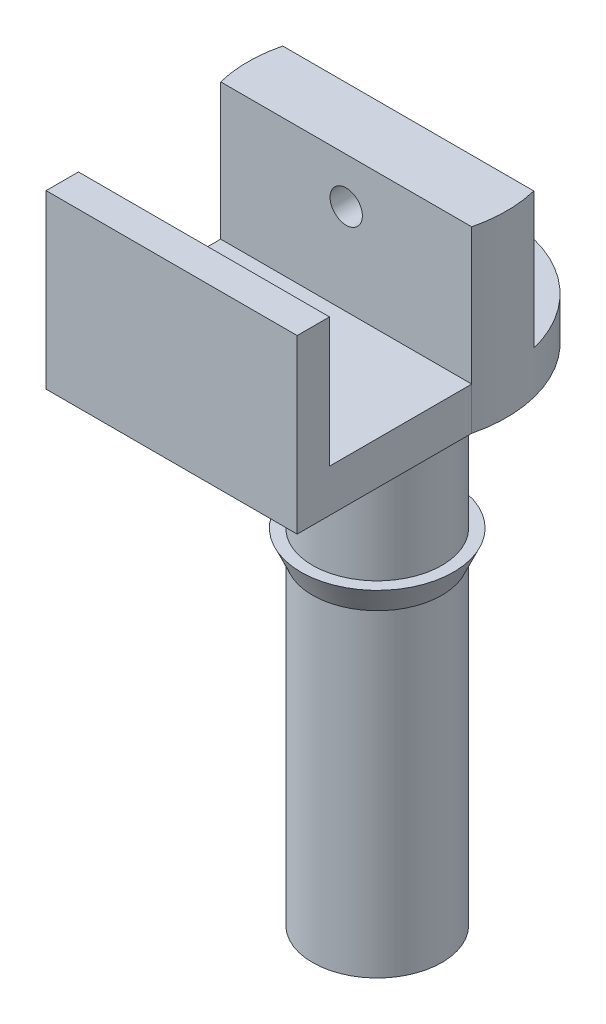
ISO-10303-21;
HEADER;
FILE_DESCRIPTION(('STEP AP214'),'2;1');
FILE_NAME('part.step','',(''),(''),'','','');
FILE_SCHEMA(('AUTOMOTIVE_DESIGN { 1 0 10303 214 1 1 1 1 }'));
ENDSEC;
DATA;
#1=APPLICATION_CONTEXT('core data for automotive mechanical design processes');
#2=APPLICATION_PROTOCOL_DEFINITION('international standard','automotive_design',2000,#1);
#3=PRODUCT_CONTEXT('',#1,'mechanical');
#4=PRODUCT('Part','Part','',(#3));
#5=PRODUCT_RELATED_PRODUCT_CATEGORY('part','',(#4));
#6=PRODUCT_DEFINITION_FORMATION('','',#4);
#7=PRODUCT_DEFINITION_CONTEXT('part definition',#1,'design');
#8=PRODUCT_DEFINITION('design','',#6,#7);
#9=PRODUCT_DEFINITION_SHAPE('','',#8);
#10=(LENGTH_UNIT() NAMED_UNIT(*) SI_UNIT(.MILLI.,.METRE.));
#11=(NAMED_UNIT(*) PLANE_ANGLE_UNIT() SI_UNIT($,.RADIAN.));
#12=(NAMED_UNIT(*) SI_UNIT($,.STERADIAN.) SOLID_ANGLE_UNIT());
#13=UNCERTAINTY_MEASURE_WITH_UNIT(LENGTH_MEASURE(1.E-05),#10,'distance_accuracy_value','');
#14=(GEOMETRIC_REPRESENTATION_CONTEXT(3) GLOBAL_UNCERTAINTY_ASSIGNED_CONTEXT((#13)) GLOBAL_UNIT_ASSIGNED_CONTEXT((#10,
#11,#12)) REPRESENTATION_CONTEXT('',''));
#15=CARTESIAN_POINT('',(0.,0.,0.));
#16=DIRECTION('',(0.,0.,1.));
#17=DIRECTION('',(1.,0.,0.));
#18=AXIS2_PLACEMENT_3D('',#15,#16,#17);
#19=CARTESIAN_POINT('',(-25.4,107.442,0.));
#20=DIRECTION('',(0.,-1.,0.));
#21=DIRECTION('',(0.,0.,-1.));
#22=AXIS2_PLACEMENT_3D('',#19,#20,#21);
#23=PLANE('',#22);
#24=DIRECTION('',(-1.,0.,0.));
#25=VECTOR('',#24,1.);
#26=CARTESIAN_POINT('',(-7.02009648395107,107.442,34.0359999999995));
#27=LINE('',#26,#25);
#28=CARTESIAN_POINT('',(24.6576313542076,107.442,34.0359999999996));
#29=VERTEX_POINT('',#28);
#30=CARTESIAN_POINT('',(-24.6576313542076,107.442,34.0359999999995));
#31=VERTEX_POINT('',#30);
#32=EDGE_CURVE('E64',#29,#31,#27,.T.);
#33=ORIENTED_EDGE('',*,*,#32,.F.);
#34=DIRECTION('',(0.,0.,1.));
#35=VECTOR('',#34,1.);
#36=CARTESIAN_POINT('',(24.6576313542076,107.442,3.76835047841759E-13));
#37=LINE('',#36,#35);
#38=CARTESIAN_POINT('',(24.6576313542076,107.442,6.096));
#39=VERTEX_POINT('',#38);
#40=EDGE_CURVE('E170',#39,#29,#37,.T.);
#41=ORIENTED_EDGE('',*,*,#40,.F.);
#42=DIRECTION('',(1.,0.,0.));
#43=VECTOR('',#42,1.);
#44=CARTESIAN_POINT('',(-25.4,107.442,6.096));
#45=LINE('',#44,#43);
#46=CARTESIAN_POINT('',(-24.6576313542076,107.442,6.096));
#47=VERTEX_POINT('',#46);
#48=EDGE_CURVE('E185',#47,#39,#45,.T.);
#49=ORIENTED_EDGE('',*,*,#48,.F.);
#50=DIRECTION('',(0.,0.,1.));
#51=VECTOR('',#50,1.);
#52=CARTESIAN_POINT('',(-24.6576313542076,107.442,3.84319592368815E-13));
#53=LINE('',#52,#51);
#54=EDGE_CURVE('E67',#47,#31,#53,.T.);
#55=ORIENTED_EDGE('',*,*,#54,.T.);
#56=EDGE_LOOP('',(#33,#41,#49,#55));
#57=FACE_BOUND('',#56,.T.);
#58=ADVANCED_FACE('F50',(#57),#23,.F.);
#59=CARTESIAN_POINT('',(0.,134.2,0.));
#60=DIRECTION('',(0.,-1.,0.));
#61=DIRECTION('',(0.,0.,-1.));
#62=AXIS2_PLACEMENT_3D('',#59,#60,#61);
#63=CYLINDRICAL_SURFACE('',#62,25.4);
#64=DIRECTION('',(0.,1.,0.));
#65=VECTOR('',#64,1.);
#66=CARTESIAN_POINT('',(24.6576313542076,38.9950415300238,6.09599999999976));
#67=LINE('',#66,#65);
#68=CARTESIAN_POINT('',(24.6576313542076,99.06,6.09599999999976));
#69=VERTEX_POINT('',#68);
#70=EDGE_CURVE('E175',#69,#39,#67,.T.);
#71=ORIENTED_EDGE('',*,*,#70,.F.);
#72=CARTESIAN_POINT('',(0.,99.06,0.));
#73=DIRECTION('',(0.,1.,0.));
#74=DIRECTION('',(0.,0.,1.));
#75=AXIS2_PLACEMENT_3D('',#72,#73,#74);
#76=CIRCLE('',#75,25.4);
#77=CARTESIAN_POINT('',(-24.6576313542076,99.06,6.09599999999988));
#78=VERTEX_POINT('',#77);
#79=EDGE_CURVE('E215',#69,#78,#76,.T.);
#80=ORIENTED_EDGE('',*,*,#79,.T.);
#81=DIRECTION('',(0.,1.,0.));
#82=VECTOR('',#81,1.);
#83=CARTESIAN_POINT('',(-24.6576313542076,38.9950415300238,6.09599999999975));
#84=LINE('',#83,#82);
#85=EDGE_CURVE('E163',#78,#47,#84,.T.);
#86=ORIENTED_EDGE('',*,*,#85,.T.);
#87=DIRECTION('',(0.,-1.,0.));
#88=VECTOR('',#87,1.);
#89=CARTESIAN_POINT('',(-24.6576313542076,134.2,6.096));
#90=LINE('',#89,#88);
#91=CARTESIAN_POINT('',(-24.6576313542076,134.2,6.096));
#92=VERTEX_POINT('',#91);
#93=EDGE_CURVE('E197',#92,#47,#90,.T.);
#94=ORIENTED_EDGE('',*,*,#93,.F.);
#95=CARTESIAN_POINT('',(0.,134.2,0.));
#96=DIRECTION('',(0.,1.,0.));
#97=DIRECTION('',(0.,0.,1.));
#98=AXIS2_PLACEMENT_3D('',#95,#96,#97);
#99=CIRCLE('',#98,25.4);
#100=CARTESIAN_POINT('',(-24.6576313542076,134.2,-6.096));
#101=VERTEX_POINT('',#100);
#102=EDGE_CURVE('E214',#101,#92,#99,.T.);
#103=ORIENTED_EDGE('',*,*,#102,.F.);
#104=DIRECTION('',(0.,-1.,0.));
#105=VECTOR('',#104,1.);
#106=CARTESIAN_POINT('',(-24.6576313542076,134.2,-6.096));
#107=LINE('',#106,#105);
#108=CARTESIAN_POINT('',(-24.6576313542076,107.442,-6.096));
#109=VERTEX_POINT('',#108);
#110=EDGE_CURVE('E206',#101,#109,#107,.T.);
#111=ORIENTED_EDGE('',*,*,#110,.T.);
#112=CARTESIAN_POINT('',(0.,107.442,0.));
#113=DIRECTION('',(0.,1.,0.));
#114=DIRECTION('',(0.,0.,1.));
#115=AXIS2_PLACEMENT_3D('',#112,#113,#114);
#116=CIRCLE('',#115,25.4);
#117=CARTESIAN_POINT('',(24.6576313542076,107.442,-6.096));
#118=VERTEX_POINT('',#117);
#119=EDGE_CURVE('E11',#118,#109,#116,.T.);
#120=ORIENTED_EDGE('',*,*,#119,.F.);
#121=DIRECTION('',(0.,-1.,0.));
#122=VECTOR('',#121,1.);
#123=CARTESIAN_POINT('',(24.6576313542076,134.2,-6.096));
#124=LINE('',#123,#122);
#125=CARTESIAN_POINT('',(24.6576313542076,134.2,-6.096));
#126=VERTEX_POINT('',#125);
#127=EDGE_CURVE('E204',#118,#126,#124,.F.);
#128=ORIENTED_EDGE('',*,*,#127,.T.);
#129=CARTESIAN_POINT('',(24.6576313542076,134.2,6.096));
#130=VERTEX_POINT('',#129);
#131=EDGE_CURVE('E216',#130,#126,#99,.T.);
#132=ORIENTED_EDGE('',*,*,#131,.F.);
#133=DIRECTION('',(0.,-1.,0.));
#134=VECTOR('',#133,1.);
#135=CARTESIAN_POINT('',(24.6576313542076,134.2,6.096));
#136=LINE('',#135,#134);
#137=EDGE_CURVE('E190',#39,#130,#136,.F.);
#138=ORIENTED_EDGE('',*,*,#137,.F.);
#139=EDGE_LOOP('',(#71,#80,#86,#94,#103,#111,#120,#128,#132,#138));
#140=FACE_BOUND('',#139,.T.);
#141=ADVANCED_FACE('F253',(#140),#63,.T.);
#142=CARTESIAN_POINT('',(0.,134.2,0.));
#143=DIRECTION('',(0.,1.,0.));
#144=DIRECTION('',(0.,0.,1.));
#145=AXIS2_PLACEMENT_3D('',#142,#143,#144);
#146=PLANE('',#145);
#147=DIRECTION('',(1.,0.,0.));
#148=VECTOR('',#147,1.);
#149=CARTESIAN_POINT('',(-25.4,134.2,-6.096));
#150=LINE('',#149,#148);
#151=EDGE_CURVE('E57',#101,#126,#150,.T.);
#152=ORIENTED_EDGE('',*,*,#151,.F.);
#153=ORIENTED_EDGE('',*,*,#102,.T.);
#154=DIRECTION('',(1.,0.,0.));
#155=VECTOR('',#154,1.);
#156=CARTESIAN_POINT('',(-25.4,134.2,6.096));
#157=LINE('',#156,#155);
#158=EDGE_CURVE('E188',#92,#130,#157,.T.);
#159=ORIENTED_EDGE('',*,*,#158,.T.);
#160=ORIENTED_EDGE('',*,*,#131,.T.);
#161=EDGE_LOOP('',(#152,#153,#159,#160));
#162=FACE_BOUND('',#161,.T.);
#163=ADVANCED_FACE('F255',(#162),#146,.T.);
#164=CARTESIAN_POINT('',(0.,99.06,0.));
#165=DIRECTION('',(0.,-1.,0.));
#166=DIRECTION('',(0.,0.,-1.));
#167=AXIS2_PLACEMENT_3D('',#164,#165,#166);
#168=CYLINDRICAL_SURFACE('',#167,12.7);
#169=CARTESIAN_POINT('',(0.,62.484,0.));
#170=DIRECTION('',(0.,1.,0.));
#171=DIRECTION('',(0.,0.,1.));
#172=AXIS2_PLACEMENT_3D('',#169,#170,#171);
#173=CIRCLE('',#172,12.7);
#174=CARTESIAN_POINT('',(0.,62.484,12.7));
#175=VERTEX_POINT('',#174);
#176=EDGE_CURVE('E230',#175,#175,#173,.T.);
#177=ORIENTED_EDGE('',*,*,#176,.F.);
#178=EDGE_LOOP('',(#177));
#179=FACE_BOUND('',#178,.T.);
#180=CARTESIAN_POINT('',(0.,0.,0.));
#181=DIRECTION('',(0.,1.,0.));
#182=DIRECTION('',(0.,0.,1.));
#183=AXIS2_PLACEMENT_3D('',#180,#181,#182);
#184=CIRCLE('',#183,12.7);
#185=CARTESIAN_POINT('',(0.,0.,12.7));
#186=VERTEX_POINT('',#185);
#187=EDGE_CURVE('E231',#186,#186,#184,.T.);
#188=ORIENTED_EDGE('',*,*,#187,.T.);
#189=EDGE_LOOP('',(#188));
#190=FACE_BOUND('',#189,.T.);
#191=ADVANCED_FACE('F239',(#179,#190),#168,.T.);
#192=CARTESIAN_POINT('',(0.,0.,0.));
#193=DIRECTION('',(0.,1.,0.));
#194=DIRECTION('',(0.,0.,1.));
#195=AXIS2_PLACEMENT_3D('',#192,#193,#194);
#196=PLANE('',#195);
#197=ORIENTED_EDGE('',*,*,#187,.F.);
#198=EDGE_LOOP('',(#197));
#199=FACE_BOUND('',#198,.T.);
#200=ADVANCED_FACE('F245',(#199),#196,.F.);
#201=CARTESIAN_POINT('',(0.,67.564,0.));
#202=DIRECTION('',(0.,1.,0.));
#203=DIRECTION('',(0.,0.,1.));
#204=AXIS2_PLACEMENT_3D('',#201,#202,#203);
#205=CONICAL_SURFACE('',#204,14.986,0.422853926132941);
#206=ORIENTED_EDGE('',*,*,#176,.T.);
#207=EDGE_LOOP('',(#206));
#208=FACE_BOUND('',#207,.T.);
#209=CARTESIAN_POINT('',(0.,67.564,0.));
#210=DIRECTION('',(0.,1.,0.));
#211=DIRECTION('',(0.,0.,1.));
#212=AXIS2_PLACEMENT_3D('',#209,#210,#211);
#213=CIRCLE('',#212,14.986);
#214=CARTESIAN_POINT('',(0.,67.564,14.986));
#215=VERTEX_POINT('',#214);
#216=EDGE_CURVE('E222',#215,#215,#213,.T.);
#217=ORIENTED_EDGE('',*,*,#216,.F.);
#218=EDGE_LOOP('',(#217));
#219=FACE_BOUND('',#218,.T.);
#220=ADVANCED_FACE('F242',(#208,#219),#205,.T.);
#221=CARTESIAN_POINT('',(0.,67.564,0.));
#222=DIRECTION('',(0.,1.,0.));
#223=DIRECTION('',(0.,0.,1.));
#224=AXIS2_PLACEMENT_3D('',#221,#222,#223);
#225=PLANE('',#224);
#226=ORIENTED_EDGE('',*,*,#216,.T.);
#227=EDGE_LOOP('',(#226));
#228=FACE_BOUND('',#227,.T.);
#229=CARTESIAN_POINT('',(0.,67.564,0.));
#230=DIRECTION('',(0.,1.,0.));
#231=DIRECTION('',(0.,0.,1.));
#232=AXIS2_PLACEMENT_3D('',#229,#230,#231);
#233=CIRCLE('',#232,12.7);
#234=CARTESIAN_POINT('',(0.,67.564,12.7));
#235=VERTEX_POINT('',#234);
#236=EDGE_CURVE('E223',#235,#235,#233,.T.);
#237=ORIENTED_EDGE('',*,*,#236,.F.);
#238=EDGE_LOOP('',(#237));
#239=FACE_BOUND('',#238,.T.);
#240=ADVANCED_FACE('F248',(#228,#239),#225,.T.);
#241=ORIENTED_EDGE('',*,*,#236,.T.);
#242=EDGE_LOOP('',(#241));
#243=FACE_BOUND('',#242,.T.);
#244=CARTESIAN_POINT('',(0.,99.06,0.));
#245=DIRECTION('',(0.,1.,0.));
#246=DIRECTION('',(0.,0.,1.));
#247=AXIS2_PLACEMENT_3D('',#244,#245,#246);
#248=CIRCLE('',#247,12.7);
#249=CARTESIAN_POINT('',(0.,99.06,12.7));
#250=VERTEX_POINT('',#249);
#251=EDGE_CURVE('E191',#250,#250,#248,.T.);
#252=ORIENTED_EDGE('',*,*,#251,.F.);
#253=EDGE_LOOP('',(#252));
#254=FACE_BOUND('',#253,.T.);
#255=ADVANCED_FACE('F47',(#243,#254),#168,.T.);
#256=CARTESIAN_POINT('',(0.,99.06,0.));
#257=DIRECTION('',(0.,1.,0.));
#258=DIRECTION('',(0.,0.,1.));
#259=AXIS2_PLACEMENT_3D('',#256,#257,#258);
#260=PLANE('',#259);
#261=ORIENTED_EDGE('',*,*,#251,.T.);
#262=EDGE_LOOP('',(#261));
#263=FACE_BOUND('',#262,.T.);
#264=ORIENTED_EDGE('',*,*,#79,.F.);
#265=DIRECTION('',(0.,0.,-1.));
#266=VECTOR('',#265,1.);
#267=CARTESIAN_POINT('',(24.6576313542076,99.06,1.30799934461988E-13));
#268=LINE('',#267,#266);
#269=CARTESIAN_POINT('',(24.6576313542076,99.06,40.3859999999996));
#270=VERTEX_POINT('',#269);
#271=EDGE_CURVE('E160',#270,#69,#268,.T.);
#272=ORIENTED_EDGE('',*,*,#271,.F.);
#273=DIRECTION('',(-1.,0.,0.));
#274=VECTOR('',#273,1.);
#275=CARTESIAN_POINT('',(0.,99.06,40.3859999999996));
#276=LINE('',#275,#274);
#277=CARTESIAN_POINT('',(-24.6576313542076,99.06,40.3859999999996));
#278=VERTEX_POINT('',#277);
#279=EDGE_CURVE('E165',#270,#278,#276,.T.);
#280=ORIENTED_EDGE('',*,*,#279,.T.);
#281=DIRECTION('',(0.,0.,-1.));
#282=VECTOR('',#281,1.);
#283=CARTESIAN_POINT('',(-24.6576313542076,99.06,1.38284478989044E-13));
#284=LINE('',#283,#282);
#285=EDGE_CURVE('E157',#278,#78,#284,.T.);
#286=ORIENTED_EDGE('',*,*,#285,.T.);
#287=EDGE_LOOP('',(#264,#272,#280,#286));
#288=FACE_BOUND('',#287,.T.);
#289=ADVANCED_FACE('F272',(#263,#288),#260,.F.);
#290=CARTESIAN_POINT('',(-25.4,0.,6.09599999999998));
#291=DIRECTION('',(0.,0.,1.));
#292=DIRECTION('',(0.,-1.,0.));
#293=AXIS2_PLACEMENT_3D('',#290,#291,#292);
#294=PLANE('',#293);
#295=CARTESIAN_POINT('',(0.,125.31,6.096));
#296=DIRECTION('',(0.,0.,1.));
#297=DIRECTION('',(0.,-1.,0.));
#298=AXIS2_PLACEMENT_3D('',#295,#296,#297);
#299=CIRCLE('',#298,3.175);
#300=CARTESIAN_POINT('',(0.,122.135,6.096));
#301=VERTEX_POINT('',#300);
#302=EDGE_CURVE('E153',#301,#301,#299,.F.);
#303=ORIENTED_EDGE('',*,*,#302,.T.);
#304=EDGE_LOOP('',(#303));
#305=FACE_BOUND('',#304,.T.);
#306=ORIENTED_EDGE('',*,*,#93,.T.);
#307=ORIENTED_EDGE('',*,*,#48,.T.);
#308=ORIENTED_EDGE('',*,*,#137,.T.);
#309=ORIENTED_EDGE('',*,*,#158,.F.);
#310=EDGE_LOOP('',(#306,#307,#308,#309));
#311=FACE_BOUND('',#310,.T.);
#312=ADVANCED_FACE('F268',(#305,#311),#294,.T.);
#313=CARTESIAN_POINT('',(-25.4,107.442,0.));
#314=DIRECTION('',(0.,1.,0.));
#315=DIRECTION('',(0.,0.,1.));
#316=AXIS2_PLACEMENT_3D('',#313,#314,#315);
#317=PLANE('',#316);
#318=DIRECTION('',(1.,0.,0.));
#319=VECTOR('',#318,1.);
#320=CARTESIAN_POINT('',(-25.4,107.442,-6.096));
#321=LINE('',#320,#319);
#322=EDGE_CURVE('E182',#109,#118,#321,.T.);
#323=ORIENTED_EDGE('',*,*,#322,.T.);
#324=ORIENTED_EDGE('',*,*,#119,.T.);
#325=EDGE_LOOP('',(#323,#324));
#326=FACE_BOUND('',#325,.T.);
#327=ADVANCED_FACE('F302',(#326),#317,.T.);
#328=CARTESIAN_POINT('',(-25.4,0.,-6.09600000000002));
#329=DIRECTION('',(0.,0.,1.));
#330=DIRECTION('',(0.,-1.,0.));
#331=AXIS2_PLACEMENT_3D('',#328,#329,#330);
#332=PLANE('',#331);
#333=CARTESIAN_POINT('',(0.,125.31,-6.09599999999999));
#334=DIRECTION('',(0.,0.,-1.));
#335=DIRECTION('',(0.,1.,0.));
#336=AXIS2_PLACEMENT_3D('',#333,#334,#335);
#337=CIRCLE('',#336,3.175);
#338=CARTESIAN_POINT('',(0.,128.485,-6.09599999999999));
#339=VERTEX_POINT('',#338);
#340=EDGE_CURVE('E331',#339,#339,#337,.T.);
#341=ORIENTED_EDGE('',*,*,#340,.F.);
#342=EDGE_LOOP('',(#341));
#343=FACE_BOUND('',#342,.T.);
#344=ORIENTED_EDGE('',*,*,#151,.T.);
#345=ORIENTED_EDGE('',*,*,#127,.F.);
#346=ORIENTED_EDGE('',*,*,#322,.F.);
#347=ORIENTED_EDGE('',*,*,#110,.F.);
#348=EDGE_LOOP('',(#344,#345,#346,#347));
#349=FACE_BOUND('',#348,.T.);
#350=ADVANCED_FACE('F301',(#343,#349),#332,.F.);
#351=CARTESIAN_POINT('',(-24.6576313542076,38.9950415300238,1.38284478989044E-13));
#352=DIRECTION('',(-1.,0.,0.));
#353=DIRECTION('',(0.,0.,1.));
#354=AXIS2_PLACEMENT_3D('',#351,#352,#353);
#355=PLANE('',#354);
#356=ORIENTED_EDGE('',*,*,#285,.F.);
#357=DIRECTION('',(0.,1.,0.));
#358=VECTOR('',#357,1.);
#359=CARTESIAN_POINT('',(-24.6576313542076,38.9950415300237,40.3859999999994));
#360=LINE('',#359,#358);
#361=CARTESIAN_POINT('',(-24.6576313542076,132.842,40.3859999999997));
#362=VERTEX_POINT('',#361);
#363=EDGE_CURVE('E145',#278,#362,#360,.T.);
#364=ORIENTED_EDGE('',*,*,#363,.T.);
#365=DIRECTION('',(0.,0.,1.));
#366=VECTOR('',#365,1.);
#367=CARTESIAN_POINT('',(-24.6576313542076,132.842,34.0359999999996));
#368=LINE('',#367,#366);
#369=CARTESIAN_POINT('',(-24.6576313542076,132.842,34.0359999999996));
#370=VERTEX_POINT('',#369);
#371=EDGE_CURVE('E123',#370,#362,#368,.T.);
#372=ORIENTED_EDGE('',*,*,#371,.F.);
#373=DIRECTION('',(0.,-1.,0.));
#374=VECTOR('',#373,1.);
#375=CARTESIAN_POINT('',(-24.6576313542076,132.842,34.0359999999996));
#376=LINE('',#375,#374);
#377=EDGE_CURVE('E133',#370,#31,#376,.T.);
#378=ORIENTED_EDGE('',*,*,#377,.T.);
#379=ORIENTED_EDGE('',*,*,#54,.F.);
#380=ORIENTED_EDGE('',*,*,#85,.F.);
#381=EDGE_LOOP('',(#356,#364,#372,#378,#379,#380));
#382=FACE_BOUND('',#381,.T.);
#383=ADVANCED_FACE('F137',(#382),#355,.T.);
#384=CARTESIAN_POINT('',(24.6576313542076,38.9950415300238,1.30799934461988E-13));
#385=DIRECTION('',(-1.,0.,0.));
#386=DIRECTION('',(0.,0.,1.));
#387=AXIS2_PLACEMENT_3D('',#384,#385,#386);
#388=PLANE('',#387);
#389=DIRECTION('',(0.,1.,0.));
#390=VECTOR('',#389,1.);
#391=CARTESIAN_POINT('',(24.6576313542076,38.9950415300237,40.3859999999994));
#392=LINE('',#391,#390);
#393=CARTESIAN_POINT('',(24.6576313542076,132.842,40.3859999999997));
#394=VERTEX_POINT('',#393);
#395=EDGE_CURVE('E174',#270,#394,#392,.T.);
#396=ORIENTED_EDGE('',*,*,#395,.F.);
#397=ORIENTED_EDGE('',*,*,#271,.T.);
#398=ORIENTED_EDGE('',*,*,#70,.T.);
#399=ORIENTED_EDGE('',*,*,#40,.T.);
#400=DIRECTION('',(0.,-1.,0.));
#401=VECTOR('',#400,1.);
#402=CARTESIAN_POINT('',(24.6576313542076,132.842,34.0359999999996));
#403=LINE('',#402,#401);
#404=CARTESIAN_POINT('',(24.6576313542076,132.842,34.0359999999996));
#405=VERTEX_POINT('',#404);
#406=EDGE_CURVE('E140',#405,#29,#403,.T.);
#407=ORIENTED_EDGE('',*,*,#406,.F.);
#408=DIRECTION('',(0.,0.,-1.));
#409=VECTOR('',#408,1.);
#410=CARTESIAN_POINT('',(24.6576313542076,132.842,40.3859999999997));
#411=LINE('',#410,#409);
#412=EDGE_CURVE('E129',#394,#405,#411,.T.);
#413=ORIENTED_EDGE('',*,*,#412,.F.);
#414=EDGE_LOOP('',(#396,#397,#398,#399,#407,#413));
#415=FACE_BOUND('',#414,.T.);
#416=ADVANCED_FACE('F295',(#415),#388,.F.);
#417=CARTESIAN_POINT('',(0.,38.9950415300237,40.3859999999994));
#418=DIRECTION('',(0.,0.,1.));
#419=DIRECTION('',(0.,-1.,0.));
#420=AXIS2_PLACEMENT_3D('',#417,#418,#419);
#421=PLANE('',#420);
#422=ORIENTED_EDGE('',*,*,#279,.F.);
#423=ORIENTED_EDGE('',*,*,#395,.T.);
#424=DIRECTION('',(1.,0.,0.));
#425=VECTOR('',#424,1.);
#426=CARTESIAN_POINT('',(-24.6576313542076,132.842,40.3859999999997));
#427=LINE('',#426,#425);
#428=EDGE_CURVE('E144',#362,#394,#427,.T.);
#429=ORIENTED_EDGE('',*,*,#428,.F.);
#430=ORIENTED_EDGE('',*,*,#363,.F.);
#431=EDGE_LOOP('',(#422,#423,#429,#430));
#432=FACE_BOUND('',#431,.T.);
#433=ADVANCED_FACE('F314',(#432),#421,.T.);
#434=CARTESIAN_POINT('',(-7.02009648395107,132.842,34.0359999999996));
#435=DIRECTION('',(0.,0.,1.));
#436=DIRECTION('',(0.,-1.,0.));
#437=AXIS2_PLACEMENT_3D('',#434,#435,#436);
#438=PLANE('',#437);
#439=ORIENTED_EDGE('',*,*,#32,.T.);
#440=ORIENTED_EDGE('',*,*,#377,.F.);
#441=DIRECTION('',(-1.,0.,0.));
#442=VECTOR('',#441,1.);
#443=CARTESIAN_POINT('',(24.6576313542076,132.842,34.0359999999996));
#444=LINE('',#443,#442);
#445=EDGE_CURVE('E119',#405,#370,#444,.T.);
#446=ORIENTED_EDGE('',*,*,#445,.F.);
#447=ORIENTED_EDGE('',*,*,#406,.T.);
#448=EDGE_LOOP('',(#439,#440,#446,#447));
#449=FACE_BOUND('',#448,.T.);
#450=ADVANCED_FACE('F132',(#449),#438,.F.);
#451=CARTESIAN_POINT('',(0.,132.842,3.26113405285945E-13));
#452=DIRECTION('',(0.,1.,0.));
#453=DIRECTION('',(0.,0.,1.));
#454=AXIS2_PLACEMENT_3D('',#451,#452,#453);
#455=PLANE('',#454);
#456=ORIENTED_EDGE('',*,*,#445,.T.);
#457=ORIENTED_EDGE('',*,*,#371,.T.);
#458=ORIENTED_EDGE('',*,*,#428,.T.);
#459=ORIENTED_EDGE('',*,*,#412,.T.);
#460=EDGE_LOOP('',(#456,#457,#458,#459));
#461=FACE_BOUND('',#460,.T.);
#462=ADVANCED_FACE('F125',(#461),#455,.T.);
#463=CARTESIAN_POINT('',(0.,125.31,15.0762561210692));
#464=DIRECTION('',(0.,0.,-1.));
#465=DIRECTION('',(0.,1.,0.));
#466=AXIS2_PLACEMENT_3D('',#463,#464,#465);
#467=CYLINDRICAL_SURFACE('',#466,3.175);
#468=ORIENTED_EDGE('',*,*,#340,.T.);
#469=EDGE_LOOP('',(#468));
#470=FACE_BOUND('',#469,.T.);
#471=ORIENTED_EDGE('',*,*,#302,.F.);
#472=EDGE_LOOP('',(#471));
#473=FACE_BOUND('',#472,.T.);
#474=ADVANCED_FACE('F323',(#470,#473),#467,.F.);
#475=CLOSED_SHELL('',(#58,#141,#163,#191,#200,#220,#240,#255,#289,#312,#327,#350,#383,#416,#433,
#450,#462,#474));
#476=MANIFOLD_SOLID_BREP('B2',#475);
#477=ADVANCED_BREP_SHAPE_REPRESENTATION('',(#18,#476),#14);
#478=SHAPE_DEFINITION_REPRESENTATION(#9,#477);
ENDSEC;
END-ISO-10303-21;
